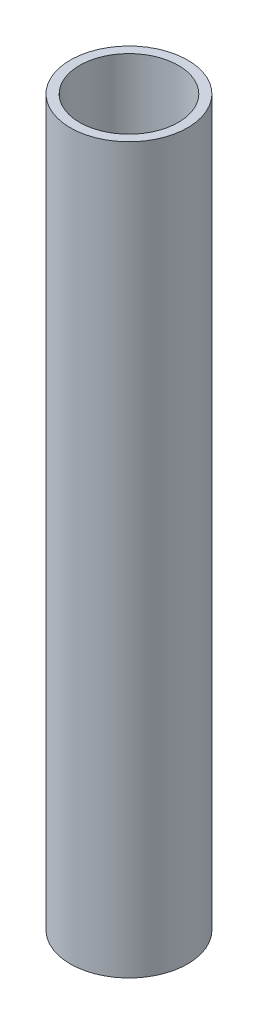
ISO-10303-21;
HEADER;
FILE_DESCRIPTION(('STEP AP214'),'2;1');
FILE_NAME('part.step','',(''),(''),'','','');
FILE_SCHEMA(('AUTOMOTIVE_DESIGN { 1 0 10303 214 1 1 1 1 }'));
ENDSEC;
DATA;
#1=APPLICATION_CONTEXT('core data for automotive mechanical design processes');
#2=APPLICATION_PROTOCOL_DEFINITION('international standard','automotive_design',2000,#1);
#3=PRODUCT_CONTEXT('',#1,'mechanical');
#4=PRODUCT('Part','Part','',(#3));
#5=PRODUCT_RELATED_PRODUCT_CATEGORY('part','',(#4));
#6=PRODUCT_DEFINITION_FORMATION('','',#4);
#7=PRODUCT_DEFINITION_CONTEXT('part definition',#1,'design');
#8=PRODUCT_DEFINITION('design','',#6,#7);
#9=PRODUCT_DEFINITION_SHAPE('','',#8);
#10=(LENGTH_UNIT() NAMED_UNIT(*) SI_UNIT(.MILLI.,.METRE.));
#11=(NAMED_UNIT(*) PLANE_ANGLE_UNIT() SI_UNIT($,.RADIAN.));
#12=(NAMED_UNIT(*) SI_UNIT($,.STERADIAN.) SOLID_ANGLE_UNIT());
#13=UNCERTAINTY_MEASURE_WITH_UNIT(LENGTH_MEASURE(1.E-05),#10,'distance_accuracy_value','');
#14=(GEOMETRIC_REPRESENTATION_CONTEXT(3) GLOBAL_UNCERTAINTY_ASSIGNED_CONTEXT((#13)) GLOBAL_UNIT_ASSIGNED_CONTEXT((#10,
#11,#12)) REPRESENTATION_CONTEXT('',''));
#15=CARTESIAN_POINT('',(0.,0.,0.));
#16=DIRECTION('',(0.,0.,1.));
#17=DIRECTION('',(1.,0.,0.));
#18=AXIS2_PLACEMENT_3D('',#15,#16,#17);
#19=CARTESIAN_POINT('',(0.,186.182,0.));
#20=DIRECTION('',(0.,1.,0.));
#21=DIRECTION('',(0.,0.,1.));
#22=AXIS2_PLACEMENT_3D('',#19,#20,#21);
#23=PLANE('',#22);
#24=CARTESIAN_POINT('',(0.,186.182,0.));
#25=DIRECTION('',(0.,1.,0.));
#26=DIRECTION('',(0.,0.,1.));
#27=AXIS2_PLACEMENT_3D('',#24,#25,#26);
#28=CIRCLE('',#27,30.1625);
#29=CARTESIAN_POINT('',(0.,186.182,30.1625));
#30=VERTEX_POINT('',#29);
#31=EDGE_CURVE('E10',#30,#30,#28,.T.);
#32=ORIENTED_EDGE('',*,*,#31,.T.);
#33=EDGE_LOOP('',(#32));
#34=FACE_BOUND('',#33,.T.);
#35=CARTESIAN_POINT('',(0.,186.182,0.));
#36=DIRECTION('',(0.,1.,0.));
#37=DIRECTION('',(0.,0.,1.));
#38=AXIS2_PLACEMENT_3D('',#35,#36,#37);
#39=CIRCLE('',#38,25.4);
#40=CARTESIAN_POINT('',(0.,186.182,25.4));
#41=VERTEX_POINT('',#40);
#42=EDGE_CURVE('E46',#41,#41,#39,.T.);
#43=ORIENTED_EDGE('',*,*,#42,.F.);
#44=EDGE_LOOP('',(#43));
#45=FACE_BOUND('',#44,.T.);
#46=ADVANCED_FACE('F35',(#34,#45),#23,.T.);
#47=CARTESIAN_POINT('',(0.,-186.182,0.));
#48=DIRECTION('',(0.,1.,0.));
#49=DIRECTION('',(0.,0.,1.));
#50=AXIS2_PLACEMENT_3D('',#47,#48,#49);
#51=PLANE('',#50);
#52=CARTESIAN_POINT('',(0.,-186.182,0.));
#53=DIRECTION('',(0.,1.,0.));
#54=DIRECTION('',(0.,0.,1.));
#55=AXIS2_PLACEMENT_3D('',#52,#53,#54);
#56=CIRCLE('',#55,30.1625);
#57=CARTESIAN_POINT('',(0.,-186.182,30.1625));
#58=VERTEX_POINT('',#57);
#59=EDGE_CURVE('E39',#58,#58,#56,.T.);
#60=ORIENTED_EDGE('',*,*,#59,.F.);
#61=EDGE_LOOP('',(#60));
#62=FACE_BOUND('',#61,.T.);
#63=CARTESIAN_POINT('',(0.,-186.182,0.));
#64=DIRECTION('',(0.,1.,0.));
#65=DIRECTION('',(0.,0.,1.));
#66=AXIS2_PLACEMENT_3D('',#63,#64,#65);
#67=CIRCLE('',#66,25.4);
#68=CARTESIAN_POINT('',(0.,-186.182,25.4));
#69=VERTEX_POINT('',#68);
#70=EDGE_CURVE('E48',#69,#69,#67,.T.);
#71=ORIENTED_EDGE('',*,*,#70,.T.);
#72=EDGE_LOOP('',(#71));
#73=FACE_BOUND('',#72,.T.);
#74=ADVANCED_FACE('F58',(#62,#73),#51,.F.);
#75=CARTESIAN_POINT('',(0.,186.182,0.));
#76=DIRECTION('',(0.,-1.,0.));
#77=DIRECTION('',(0.,0.,-1.));
#78=AXIS2_PLACEMENT_3D('',#75,#76,#77);
#79=CYLINDRICAL_SURFACE('',#78,30.1625);
#80=ORIENTED_EDGE('',*,*,#31,.F.);
#81=EDGE_LOOP('',(#80));
#82=FACE_BOUND('',#81,.T.);
#83=ORIENTED_EDGE('',*,*,#59,.T.);
#84=EDGE_LOOP('',(#83));
#85=FACE_BOUND('',#84,.T.);
#86=ADVANCED_FACE('F37',(#82,#85),#79,.T.);
#87=CARTESIAN_POINT('',(0.,186.182,0.));
#88=DIRECTION('',(0.,-1.,0.));
#89=DIRECTION('',(0.,0.,-1.));
#90=AXIS2_PLACEMENT_3D('',#87,#88,#89);
#91=CYLINDRICAL_SURFACE('',#90,25.4);
#92=ORIENTED_EDGE('',*,*,#42,.T.);
#93=EDGE_LOOP('',(#92));
#94=FACE_BOUND('',#93,.T.);
#95=ORIENTED_EDGE('',*,*,#70,.F.);
#96=EDGE_LOOP('',(#95));
#97=FACE_BOUND('',#96,.T.);
#98=ADVANCED_FACE('F54',(#94,#97),#91,.F.);
#99=CLOSED_SHELL('',(#46,#74,#86,#98));
#100=MANIFOLD_SOLID_BREP('B2',#99);
#101=ADVANCED_BREP_SHAPE_REPRESENTATION('',(#18,#100),#14);
#102=SHAPE_DEFINITION_REPRESENTATION(#9,#101);
ENDSEC;
END-ISO-10303-21;
